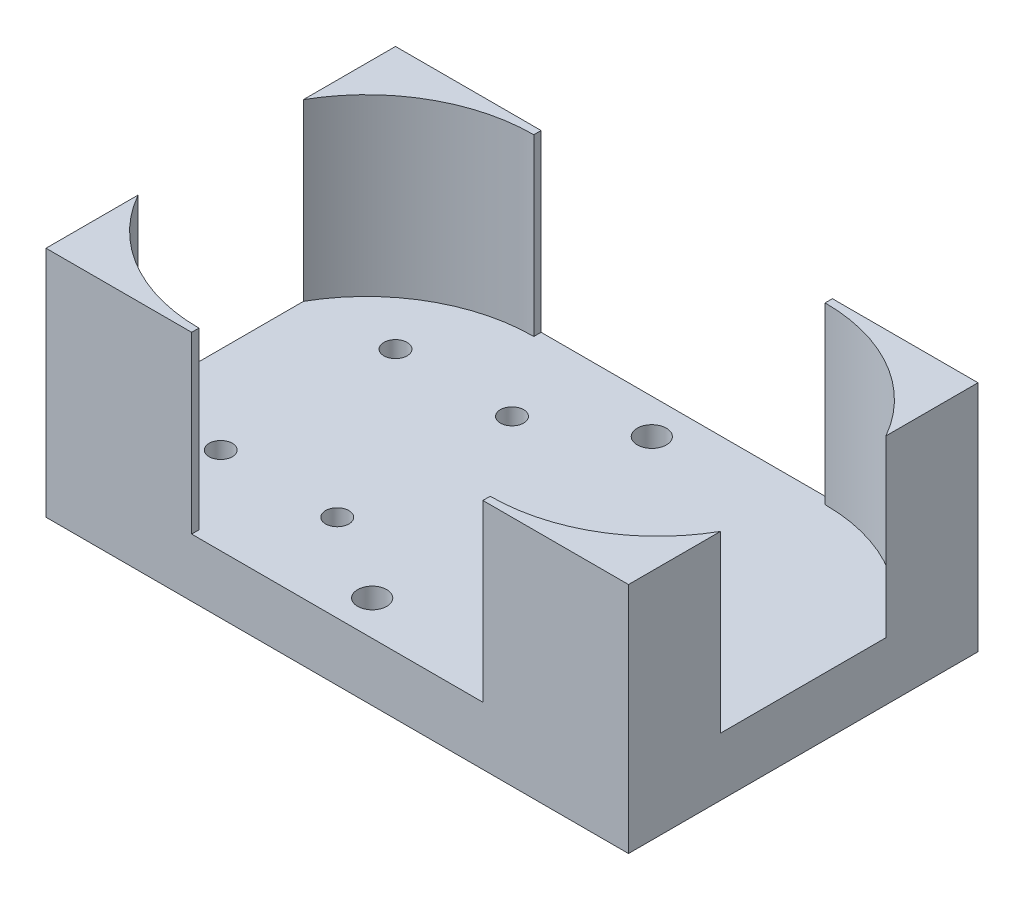
ISO-10303-21;
HEADER;
FILE_DESCRIPTION(('STEP AP214'),'2;1');
FILE_NAME('part.step','',(''),(''),'','','');
FILE_SCHEMA(('AUTOMOTIVE_DESIGN { 1 0 10303 214 1 1 1 1 }'));
ENDSEC;
DATA;
#1=APPLICATION_CONTEXT('core data for automotive mechanical design processes');
#2=APPLICATION_PROTOCOL_DEFINITION('international standard','automotive_design',2000,#1);
#3=PRODUCT_CONTEXT('',#1,'mechanical');
#4=PRODUCT('Part','Part','',(#3));
#5=PRODUCT_RELATED_PRODUCT_CATEGORY('part','',(#4));
#6=PRODUCT_DEFINITION_FORMATION('','',#4);
#7=PRODUCT_DEFINITION_CONTEXT('part definition',#1,'design');
#8=PRODUCT_DEFINITION('design','',#6,#7);
#9=PRODUCT_DEFINITION_SHAPE('','',#8);
#10=(LENGTH_UNIT() NAMED_UNIT(*) SI_UNIT(.MILLI.,.METRE.));
#11=(NAMED_UNIT(*) PLANE_ANGLE_UNIT() SI_UNIT($,.RADIAN.));
#12=(NAMED_UNIT(*) SI_UNIT($,.STERADIAN.) SOLID_ANGLE_UNIT());
#13=UNCERTAINTY_MEASURE_WITH_UNIT(LENGTH_MEASURE(1.E-05),#10,'distance_accuracy_value','');
#14=(GEOMETRIC_REPRESENTATION_CONTEXT(3) GLOBAL_UNCERTAINTY_ASSIGNED_CONTEXT((#13)) GLOBAL_UNIT_ASSIGNED_CONTEXT((#10,
#11,#12)) REPRESENTATION_CONTEXT('',''));
#15=CARTESIAN_POINT('',(0.,0.,0.));
#16=DIRECTION('',(0.,0.,1.));
#17=DIRECTION('',(1.,0.,0.));
#18=AXIS2_PLACEMENT_3D('',#15,#16,#17);
#19=CARTESIAN_POINT('',(10.,8.,-1.2));
#20=DIRECTION('',(0.,-1.,0.));
#21=DIRECTION('',(0.,0.,-1.));
#22=AXIS2_PLACEMENT_3D('',#19,#20,#21);
#23=CYLINDRICAL_SURFACE('',#22,0.500000000000001);
#24=CARTESIAN_POINT('',(10.,2.,-1.2));
#25=DIRECTION('',(0.,-1.,0.));
#26=DIRECTION('',(0.,0.,-1.));
#27=AXIS2_PLACEMENT_3D('',#24,#25,#26);
#28=CIRCLE('',#27,0.500000000000001);
#29=CARTESIAN_POINT('',(10.,2.,-1.7));
#30=VERTEX_POINT('',#29);
#31=EDGE_CURVE('E294',#30,#30,#28,.T.);
#32=ORIENTED_EDGE('',*,*,#31,.F.);
#33=EDGE_LOOP('',(#32));
#34=FACE_BOUND('',#33,.T.);
#35=CARTESIAN_POINT('',(10.,1.,-1.2));
#36=DIRECTION('',(0.,-1.,0.));
#37=DIRECTION('',(0.,0.,-1.));
#38=AXIS2_PLACEMENT_3D('',#35,#36,#37);
#39=CIRCLE('',#38,0.500000000000001);
#40=CARTESIAN_POINT('',(10.,1.,-1.7));
#41=VERTEX_POINT('',#40);
#42=EDGE_CURVE('E47',#41,#41,#39,.F.);
#43=ORIENTED_EDGE('',*,*,#42,.F.);
#44=EDGE_LOOP('',(#43));
#45=FACE_BOUND('',#44,.T.);
#46=ADVANCED_FACE('F43',(#34,#45),#23,.F.);
#47=CARTESIAN_POINT('',(10.,8.,-10.8));
#48=DIRECTION('',(0.,-1.,0.));
#49=DIRECTION('',(0.,0.,-1.));
#50=AXIS2_PLACEMENT_3D('',#47,#48,#49);
#51=CYLINDRICAL_SURFACE('',#50,0.500000000000001);
#52=CARTESIAN_POINT('',(10.,2.,-10.8));
#53=DIRECTION('',(0.,-1.,0.));
#54=DIRECTION('',(0.,0.,-1.));
#55=AXIS2_PLACEMENT_3D('',#52,#53,#54);
#56=CIRCLE('',#55,0.500000000000001);
#57=CARTESIAN_POINT('',(10.,2.,-11.3));
#58=VERTEX_POINT('',#57);
#59=EDGE_CURVE('E185',#58,#58,#56,.T.);
#60=ORIENTED_EDGE('',*,*,#59,.F.);
#61=EDGE_LOOP('',(#60));
#62=FACE_BOUND('',#61,.T.);
#63=CARTESIAN_POINT('',(10.,1.,-10.8));
#64=DIRECTION('',(0.,-1.,0.));
#65=DIRECTION('',(0.,0.,-1.));
#66=AXIS2_PLACEMENT_3D('',#63,#64,#65);
#67=CIRCLE('',#66,0.500000000000001);
#68=CARTESIAN_POINT('',(10.,1.,-11.3));
#69=VERTEX_POINT('',#68);
#70=EDGE_CURVE('E288',#69,#69,#67,.F.);
#71=ORIENTED_EDGE('',*,*,#70,.F.);
#72=EDGE_LOOP('',(#71));
#73=FACE_BOUND('',#72,.T.);
#74=ADVANCED_FACE('F318',(#62,#73),#51,.F.);
#75=CARTESIAN_POINT('',(0.,2.,0.));
#76=DIRECTION('',(1.,0.,0.));
#77=DIRECTION('',(0.,0.,-1.));
#78=AXIS2_PLACEMENT_3D('',#75,#76,#77);
#79=PLANE('',#78);
#80=DIRECTION('',(0.,0.,1.));
#81=VECTOR('',#80,1.);
#82=CARTESIAN_POINT('',(0.,0.,0.));
#83=LINE('',#82,#81);
#84=CARTESIAN_POINT('',(0.,0.,-12.));
#85=VERTEX_POINT('',#84);
#86=CARTESIAN_POINT('',(0.,0.,0.));
#87=VERTEX_POINT('',#86);
#88=EDGE_CURVE('E264',#85,#87,#83,.T.);
#89=ORIENTED_EDGE('',*,*,#88,.T.);
#90=DIRECTION('',(0.,-1.,0.));
#91=VECTOR('',#90,1.);
#92=CARTESIAN_POINT('',(0.,2.,0.));
#93=LINE('',#92,#91);
#94=CARTESIAN_POINT('',(0.,8.,0.));
#95=VERTEX_POINT('',#94);
#96=EDGE_CURVE('E12',#95,#87,#93,.T.);
#97=ORIENTED_EDGE('',*,*,#96,.F.);
#98=DIRECTION('',(0.,0.,1.));
#99=VECTOR('',#98,1.);
#100=CARTESIAN_POINT('',(0.,8.,0.));
#101=LINE('',#100,#99);
#102=CARTESIAN_POINT('',(0.,8.,-3.16054582709987));
#103=VERTEX_POINT('',#102);
#104=EDGE_CURVE('E221',#103,#95,#101,.T.);
#105=ORIENTED_EDGE('',*,*,#104,.F.);
#106=DIRECTION('',(0.,-1.,0.));
#107=VECTOR('',#106,1.);
#108=CARTESIAN_POINT('',(0.,8.,-3.16054582709987));
#109=LINE('',#108,#107);
#110=CARTESIAN_POINT('',(0.,2.,-3.16054582709987));
#111=VERTEX_POINT('',#110);
#112=EDGE_CURVE('E237',#103,#111,#109,.T.);
#113=ORIENTED_EDGE('',*,*,#112,.T.);
#114=DIRECTION('',(0.,0.,1.));
#115=VECTOR('',#114,1.);
#116=CARTESIAN_POINT('',(0.,2.,0.));
#117=LINE('',#116,#115);
#118=CARTESIAN_POINT('',(0.,2.,-8.83945417290012));
#119=VERTEX_POINT('',#118);
#120=EDGE_CURVE('E265',#119,#111,#117,.T.);
#121=ORIENTED_EDGE('',*,*,#120,.F.);
#122=DIRECTION('',(0.,-1.,0.));
#123=VECTOR('',#122,1.);
#124=CARTESIAN_POINT('',(0.,8.,-8.83945417290012));
#125=LINE('',#124,#123);
#126=CARTESIAN_POINT('',(0.,8.,-8.83945417290012));
#127=VERTEX_POINT('',#126);
#128=EDGE_CURVE('E252',#127,#119,#125,.T.);
#129=ORIENTED_EDGE('',*,*,#128,.F.);
#130=DIRECTION('',(0.,0.,1.));
#131=VECTOR('',#130,1.);
#132=CARTESIAN_POINT('',(0.,8.,0.));
#133=LINE('',#132,#131);
#134=CARTESIAN_POINT('',(0.,8.,-12.));
#135=VERTEX_POINT('',#134);
#136=EDGE_CURVE('E250',#135,#127,#133,.T.);
#137=ORIENTED_EDGE('',*,*,#136,.F.);
#138=DIRECTION('',(0.,-1.,0.));
#139=VECTOR('',#138,1.);
#140=CARTESIAN_POINT('',(0.,2.,-12.));
#141=LINE('',#140,#139);
#142=EDGE_CURVE('E274',#135,#85,#141,.T.);
#143=ORIENTED_EDGE('',*,*,#142,.T.);
#144=EDGE_LOOP('',(#89,#97,#105,#113,#121,#129,#137,#143));
#145=FACE_BOUND('',#144,.T.);
#146=ADVANCED_FACE('F45',(#145),#79,.F.);
#147=CARTESIAN_POINT('',(0.,2.,0.));
#148=DIRECTION('',(0.,0.,-1.));
#149=DIRECTION('',(-1.,0.,0.));
#150=AXIS2_PLACEMENT_3D('',#147,#148,#149);
#151=PLANE('',#150);
#152=DIRECTION('',(1.,0.,0.));
#153=VECTOR('',#152,1.);
#154=CARTESIAN_POINT('',(0.,0.,0.));
#155=LINE('',#154,#153);
#156=CARTESIAN_POINT('',(20.,0.,0.));
#157=VERTEX_POINT('',#156);
#158=EDGE_CURVE('E277',#87,#157,#155,.T.);
#159=ORIENTED_EDGE('',*,*,#158,.T.);
#160=DIRECTION('',(0.,-1.,0.));
#161=VECTOR('',#160,1.);
#162=CARTESIAN_POINT('',(20.,2.,0.));
#163=LINE('',#162,#161);
#164=CARTESIAN_POINT('',(20.,8.,0.));
#165=VERTEX_POINT('',#164);
#166=EDGE_CURVE('E52',#165,#157,#163,.T.);
#167=ORIENTED_EDGE('',*,*,#166,.F.);
#168=DIRECTION('',(1.,0.,0.));
#169=VECTOR('',#168,1.);
#170=CARTESIAN_POINT('',(0.,8.,0.));
#171=LINE('',#170,#169);
#172=CARTESIAN_POINT('',(15.,8.,0.));
#173=VERTEX_POINT('',#172);
#174=EDGE_CURVE('E176',#173,#165,#171,.T.);
#175=ORIENTED_EDGE('',*,*,#174,.F.);
#176=DIRECTION('',(0.,-1.,0.));
#177=VECTOR('',#176,1.);
#178=CARTESIAN_POINT('',(15.,8.,0.));
#179=LINE('',#178,#177);
#180=CARTESIAN_POINT('',(15.,2.,0.));
#181=VERTEX_POINT('',#180);
#182=EDGE_CURVE('E167',#173,#181,#179,.T.);
#183=ORIENTED_EDGE('',*,*,#182,.T.);
#184=DIRECTION('',(1.,0.,0.));
#185=VECTOR('',#184,1.);
#186=CARTESIAN_POINT('',(0.,2.,0.));
#187=LINE('',#186,#185);
#188=CARTESIAN_POINT('',(5.00000000000001,2.,0.));
#189=VERTEX_POINT('',#188);
#190=EDGE_CURVE('E65',#189,#181,#187,.T.);
#191=ORIENTED_EDGE('',*,*,#190,.F.);
#192=DIRECTION('',(0.,-1.,0.));
#193=VECTOR('',#192,1.);
#194=CARTESIAN_POINT('',(5.00000000000001,8.,0.));
#195=LINE('',#194,#193);
#196=CARTESIAN_POINT('',(5.00000000000001,8.,0.));
#197=VERTEX_POINT('',#196);
#198=EDGE_CURVE('E235',#197,#189,#195,.T.);
#199=ORIENTED_EDGE('',*,*,#198,.F.);
#200=DIRECTION('',(1.,0.,0.));
#201=VECTOR('',#200,1.);
#202=CARTESIAN_POINT('',(0.,8.,0.));
#203=LINE('',#202,#201);
#204=EDGE_CURVE('E225',#95,#197,#203,.T.);
#205=ORIENTED_EDGE('',*,*,#204,.F.);
#206=ORIENTED_EDGE('',*,*,#96,.T.);
#207=EDGE_LOOP('',(#159,#167,#175,#183,#191,#199,#205,#206));
#208=FACE_BOUND('',#207,.T.);
#209=ADVANCED_FACE('F326',(#208),#151,.F.);
#210=CARTESIAN_POINT('',(20.,2.,0.));
#211=DIRECTION('',(-1.,0.,0.));
#212=DIRECTION('',(0.,0.,1.));
#213=AXIS2_PLACEMENT_3D('',#210,#211,#212);
#214=PLANE('',#213);
#215=DIRECTION('',(0.,0.,-1.));
#216=VECTOR('',#215,1.);
#217=CARTESIAN_POINT('',(20.,0.,0.));
#218=LINE('',#217,#216);
#219=CARTESIAN_POINT('',(20.,0.,-12.));
#220=VERTEX_POINT('',#219);
#221=EDGE_CURVE('E279',#157,#220,#218,.T.);
#222=ORIENTED_EDGE('',*,*,#221,.T.);
#223=DIRECTION('',(0.,-1.,0.));
#224=VECTOR('',#223,1.);
#225=CARTESIAN_POINT('',(20.,2.,-12.));
#226=LINE('',#225,#224);
#227=CARTESIAN_POINT('',(20.,8.,-12.));
#228=VERTEX_POINT('',#227);
#229=EDGE_CURVE('E284',#228,#220,#226,.T.);
#230=ORIENTED_EDGE('',*,*,#229,.F.);
#231=DIRECTION('',(0.,0.,-1.));
#232=VECTOR('',#231,1.);
#233=CARTESIAN_POINT('',(20.,8.,0.));
#234=LINE('',#233,#232);
#235=CARTESIAN_POINT('',(20.,8.,-8.83945417290012));
#236=VERTEX_POINT('',#235);
#237=EDGE_CURVE('E197',#236,#228,#234,.T.);
#238=ORIENTED_EDGE('',*,*,#237,.F.);
#239=DIRECTION('',(0.,-1.,0.));
#240=VECTOR('',#239,1.);
#241=CARTESIAN_POINT('',(20.,8.,-8.83945417290012));
#242=LINE('',#241,#240);
#243=CARTESIAN_POINT('',(20.,2.,-8.83945417290012));
#244=VERTEX_POINT('',#243);
#245=EDGE_CURVE('E214',#236,#244,#242,.T.);
#246=ORIENTED_EDGE('',*,*,#245,.T.);
#247=DIRECTION('',(0.,0.,-1.));
#248=VECTOR('',#247,1.);
#249=CARTESIAN_POINT('',(20.,2.,0.));
#250=LINE('',#249,#248);
#251=CARTESIAN_POINT('',(20.,2.,-3.16054582709987));
#252=VERTEX_POINT('',#251);
#253=EDGE_CURVE('E270',#252,#244,#250,.T.);
#254=ORIENTED_EDGE('',*,*,#253,.F.);
#255=DIRECTION('',(0.,-1.,0.));
#256=VECTOR('',#255,1.);
#257=CARTESIAN_POINT('',(20.,8.,-3.16054582709987));
#258=LINE('',#257,#256);
#259=CARTESIAN_POINT('',(20.,8.,-3.16054582709987));
#260=VERTEX_POINT('',#259);
#261=EDGE_CURVE('E190',#260,#252,#258,.T.);
#262=ORIENTED_EDGE('',*,*,#261,.F.);
#263=DIRECTION('',(0.,0.,-1.));
#264=VECTOR('',#263,1.);
#265=CARTESIAN_POINT('',(20.,8.,0.));
#266=LINE('',#265,#264);
#267=EDGE_CURVE('E180',#165,#260,#266,.T.);
#268=ORIENTED_EDGE('',*,*,#267,.F.);
#269=ORIENTED_EDGE('',*,*,#166,.T.);
#270=EDGE_LOOP('',(#222,#230,#238,#246,#254,#262,#268,#269));
#271=FACE_BOUND('',#270,.T.);
#272=ADVANCED_FACE('F387',(#271),#214,.F.);
#273=CARTESIAN_POINT('',(0.,2.,-12.));
#274=DIRECTION('',(0.,0.,1.));
#275=DIRECTION('',(1.,0.,0.));
#276=AXIS2_PLACEMENT_3D('',#273,#274,#275);
#277=PLANE('',#276);
#278=DIRECTION('',(-1.,0.,0.));
#279=VECTOR('',#278,1.);
#280=CARTESIAN_POINT('',(0.,0.,-12.));
#281=LINE('',#280,#279);
#282=EDGE_CURVE('E268',#220,#85,#281,.T.);
#283=ORIENTED_EDGE('',*,*,#282,.T.);
#284=ORIENTED_EDGE('',*,*,#142,.F.);
#285=DIRECTION('',(-1.,0.,0.));
#286=VECTOR('',#285,1.);
#287=CARTESIAN_POINT('',(0.,8.,-12.));
#288=LINE('',#287,#286);
#289=CARTESIAN_POINT('',(5.00000000000001,8.,-12.));
#290=VERTEX_POINT('',#289);
#291=EDGE_CURVE('E247',#290,#135,#288,.T.);
#292=ORIENTED_EDGE('',*,*,#291,.F.);
#293=DIRECTION('',(0.,-1.,0.));
#294=VECTOR('',#293,1.);
#295=CARTESIAN_POINT('',(5.00000000000001,8.,-12.));
#296=LINE('',#295,#294);
#297=CARTESIAN_POINT('',(5.00000000000001,2.,-12.));
#298=VERTEX_POINT('',#297);
#299=EDGE_CURVE('E258',#290,#298,#296,.T.);
#300=ORIENTED_EDGE('',*,*,#299,.T.);
#301=DIRECTION('',(-1.,0.,0.));
#302=VECTOR('',#301,1.);
#303=CARTESIAN_POINT('',(0.,2.,-12.));
#304=LINE('',#303,#302);
#305=CARTESIAN_POINT('',(15.,2.,-12.));
#306=VERTEX_POINT('',#305);
#307=EDGE_CURVE('E272',#306,#298,#304,.T.);
#308=ORIENTED_EDGE('',*,*,#307,.F.);
#309=DIRECTION('',(0.,-1.,0.));
#310=VECTOR('',#309,1.);
#311=CARTESIAN_POINT('',(15.,8.,-12.));
#312=LINE('',#311,#310);
#313=CARTESIAN_POINT('',(15.,8.,-12.));
#314=VERTEX_POINT('',#313);
#315=EDGE_CURVE('E211',#314,#306,#312,.T.);
#316=ORIENTED_EDGE('',*,*,#315,.F.);
#317=DIRECTION('',(-1.,0.,0.));
#318=VECTOR('',#317,1.);
#319=CARTESIAN_POINT('',(0.,8.,-12.));
#320=LINE('',#319,#318);
#321=EDGE_CURVE('E201',#228,#314,#320,.T.);
#322=ORIENTED_EDGE('',*,*,#321,.F.);
#323=ORIENTED_EDGE('',*,*,#229,.T.);
#324=EDGE_LOOP('',(#283,#284,#292,#300,#308,#316,#322,#323));
#325=FACE_BOUND('',#324,.T.);
#326=ADVANCED_FACE('F380',(#325),#277,.F.);
#327=CARTESIAN_POINT('',(0.,2.,0.));
#328=DIRECTION('',(0.,-1.,0.));
#329=DIRECTION('',(0.,0.,-1.));
#330=AXIS2_PLACEMENT_3D('',#327,#328,#329);
#331=PLANE('',#330);
#332=CARTESIAN_POINT('',(7.,2.,-3.));
#333=DIRECTION('',(0.,-1.,0.));
#334=DIRECTION('',(0.,0.,-1.));
#335=AXIS2_PLACEMENT_3D('',#332,#333,#334);
#336=CIRCLE('',#335,0.4);
#337=CARTESIAN_POINT('',(7.,2.,-3.4));
#338=VERTEX_POINT('',#337);
#339=EDGE_CURVE('E308',#338,#338,#336,.T.);
#340=ORIENTED_EDGE('',*,*,#339,.T.);
#341=EDGE_LOOP('',(#340));
#342=FACE_BOUND('',#341,.T.);
#343=CARTESIAN_POINT('',(7.,2.,-9.));
#344=DIRECTION('',(0.,-1.,0.));
#345=DIRECTION('',(0.,0.,-1.));
#346=AXIS2_PLACEMENT_3D('',#343,#344,#345);
#347=CIRCLE('',#346,0.4);
#348=CARTESIAN_POINT('',(7.,2.,-9.4));
#349=VERTEX_POINT('',#348);
#350=EDGE_CURVE('E734',#349,#349,#347,.T.);
#351=ORIENTED_EDGE('',*,*,#350,.T.);
#352=EDGE_LOOP('',(#351));
#353=FACE_BOUND('',#352,.T.);
#354=CARTESIAN_POINT('',(3.,2.,-9.));
#355=DIRECTION('',(0.,-1.,0.));
#356=DIRECTION('',(0.,0.,-1.));
#357=AXIS2_PLACEMENT_3D('',#354,#355,#356);
#358=CIRCLE('',#357,0.4);
#359=CARTESIAN_POINT('',(3.,2.,-9.4));
#360=VERTEX_POINT('',#359);
#361=EDGE_CURVE('E736',#360,#360,#358,.T.);
#362=ORIENTED_EDGE('',*,*,#361,.T.);
#363=EDGE_LOOP('',(#362));
#364=FACE_BOUND('',#363,.T.);
#365=CARTESIAN_POINT('',(3.,2.,-3.));
#366=DIRECTION('',(0.,-1.,0.));
#367=DIRECTION('',(0.,0.,-1.));
#368=AXIS2_PLACEMENT_3D('',#365,#366,#367);
#369=CIRCLE('',#368,0.4);
#370=CARTESIAN_POINT('',(3.,2.,-3.4));
#371=VERTEX_POINT('',#370);
#372=EDGE_CURVE('E741',#371,#371,#369,.T.);
#373=ORIENTED_EDGE('',*,*,#372,.T.);
#374=EDGE_LOOP('',(#373));
#375=FACE_BOUND('',#374,.T.);
#376=ORIENTED_EDGE('',*,*,#59,.T.);
#377=EDGE_LOOP('',(#376));
#378=FACE_BOUND('',#377,.T.);
#379=ORIENTED_EDGE('',*,*,#31,.T.);
#380=EDGE_LOOP('',(#379));
#381=FACE_BOUND('',#380,.T.);
#382=DIRECTION('',(0.,0.,1.));
#383=VECTOR('',#382,1.);
#384=CARTESIAN_POINT('',(15.,2.,0.));
#385=LINE('',#384,#383);
#386=CARTESIAN_POINT('',(15.,2.,-0.249999999999997));
#387=VERTEX_POINT('',#386);
#388=EDGE_CURVE('E60',#387,#181,#385,.T.);
#389=ORIENTED_EDGE('',*,*,#388,.F.);
#390=CARTESIAN_POINT('',(15.,2.,-6.));
#391=DIRECTION('',(0.,1.,0.));
#392=DIRECTION('',(0.,0.,1.));
#393=AXIS2_PLACEMENT_3D('',#390,#391,#392);
#394=CIRCLE('',#393,5.75);
#395=EDGE_CURVE('E164',#387,#252,#394,.T.);
#396=ORIENTED_EDGE('',*,*,#395,.T.);
#397=ORIENTED_EDGE('',*,*,#253,.T.);
#398=CARTESIAN_POINT('',(15.,2.,-6.));
#399=DIRECTION('',(0.,1.,0.));
#400=DIRECTION('',(0.,0.,1.));
#401=AXIS2_PLACEMENT_3D('',#398,#399,#400);
#402=CIRCLE('',#401,5.75);
#403=CARTESIAN_POINT('',(15.,2.,-11.75));
#404=VERTEX_POINT('',#403);
#405=EDGE_CURVE('E166',#244,#404,#402,.T.);
#406=ORIENTED_EDGE('',*,*,#405,.T.);
#407=DIRECTION('',(0.,0.,1.));
#408=VECTOR('',#407,1.);
#409=CARTESIAN_POINT('',(15.,2.,0.));
#410=LINE('',#409,#408);
#411=EDGE_CURVE('E198',#306,#404,#410,.T.);
#412=ORIENTED_EDGE('',*,*,#411,.F.);
#413=ORIENTED_EDGE('',*,*,#307,.T.);
#414=DIRECTION('',(0.,0.,1.));
#415=VECTOR('',#414,1.);
#416=CARTESIAN_POINT('',(5.00000000000001,2.,0.));
#417=LINE('',#416,#415);
#418=CARTESIAN_POINT('',(5.00000000000001,2.,-11.75));
#419=VERTEX_POINT('',#418);
#420=EDGE_CURVE('E244',#298,#419,#417,.T.);
#421=ORIENTED_EDGE('',*,*,#420,.T.);
#422=CARTESIAN_POINT('',(5.00000000000001,2.,-6.));
#423=DIRECTION('',(0.,1.,0.));
#424=DIRECTION('',(0.,0.,1.));
#425=AXIS2_PLACEMENT_3D('',#422,#423,#424);
#426=CIRCLE('',#425,5.75);
#427=EDGE_CURVE('E239',#419,#119,#426,.T.);
#428=ORIENTED_EDGE('',*,*,#427,.T.);
#429=ORIENTED_EDGE('',*,*,#120,.T.);
#430=CARTESIAN_POINT('',(5.00000000000001,2.,-6.));
#431=DIRECTION('',(0.,1.,0.));
#432=DIRECTION('',(0.,0.,1.));
#433=AXIS2_PLACEMENT_3D('',#430,#431,#432);
#434=CIRCLE('',#433,5.75);
#435=CARTESIAN_POINT('',(5.00000000000001,2.,-0.249999999999995));
#436=VERTEX_POINT('',#435);
#437=EDGE_CURVE('E217',#111,#436,#434,.T.);
#438=ORIENTED_EDGE('',*,*,#437,.T.);
#439=DIRECTION('',(0.,0.,1.));
#440=VECTOR('',#439,1.);
#441=CARTESIAN_POINT('',(5.00000000000001,2.,0.));
#442=LINE('',#441,#440);
#443=EDGE_CURVE('E222',#436,#189,#442,.T.);
#444=ORIENTED_EDGE('',*,*,#443,.T.);
#445=ORIENTED_EDGE('',*,*,#190,.T.);
#446=EDGE_LOOP('',(#389,#396,#397,#406,#412,#413,#421,#428,#429,#438,#444,#445));
#447=FACE_BOUND('',#446,.T.);
#448=ADVANCED_FACE('F316',(#342,#353,#364,#375,#378,#381,#447),#331,.F.);
#449=CARTESIAN_POINT('',(0.,0.,0.));
#450=DIRECTION('',(0.,-1.,0.));
#451=DIRECTION('',(0.,0.,-1.));
#452=AXIS2_PLACEMENT_3D('',#449,#450,#451);
#453=PLANE('',#452);
#454=CARTESIAN_POINT('',(7.,0.,-3.));
#455=DIRECTION('',(0.,-1.,0.));
#456=DIRECTION('',(0.,0.,-1.));
#457=AXIS2_PLACEMENT_3D('',#454,#455,#456);
#458=CIRCLE('',#457,0.4);
#459=CARTESIAN_POINT('',(7.,0.,-3.4));
#460=VERTEX_POINT('',#459);
#461=EDGE_CURVE('E731',#460,#460,#458,.T.);
#462=ORIENTED_EDGE('',*,*,#461,.F.);
#463=EDGE_LOOP('',(#462));
#464=FACE_BOUND('',#463,.T.);
#465=CARTESIAN_POINT('',(7.,0.,-9.));
#466=DIRECTION('',(0.,-1.,0.));
#467=DIRECTION('',(0.,0.,-1.));
#468=AXIS2_PLACEMENT_3D('',#465,#466,#467);
#469=CIRCLE('',#468,0.4);
#470=CARTESIAN_POINT('',(7.,0.,-9.4));
#471=VERTEX_POINT('',#470);
#472=EDGE_CURVE('E749',#471,#471,#469,.T.);
#473=ORIENTED_EDGE('',*,*,#472,.F.);
#474=EDGE_LOOP('',(#473));
#475=FACE_BOUND('',#474,.T.);
#476=CARTESIAN_POINT('',(3.,0.,-9.));
#477=DIRECTION('',(0.,-1.,0.));
#478=DIRECTION('',(0.,0.,-1.));
#479=AXIS2_PLACEMENT_3D('',#476,#477,#478);
#480=CIRCLE('',#479,0.4);
#481=CARTESIAN_POINT('',(3.,0.,-9.4));
#482=VERTEX_POINT('',#481);
#483=EDGE_CURVE('E747',#482,#482,#480,.T.);
#484=ORIENTED_EDGE('',*,*,#483,.F.);
#485=EDGE_LOOP('',(#484));
#486=FACE_BOUND('',#485,.T.);
#487=CARTESIAN_POINT('',(3.,0.,-3.));
#488=DIRECTION('',(0.,-1.,0.));
#489=DIRECTION('',(0.,0.,-1.));
#490=AXIS2_PLACEMENT_3D('',#487,#488,#489);
#491=CIRCLE('',#490,0.4);
#492=CARTESIAN_POINT('',(3.,0.,-3.4));
#493=VERTEX_POINT('',#492);
#494=EDGE_CURVE('E744',#493,#493,#491,.T.);
#495=ORIENTED_EDGE('',*,*,#494,.F.);
#496=EDGE_LOOP('',(#495));
#497=FACE_BOUND('',#496,.T.);
#498=CARTESIAN_POINT('',(10.,0.,-10.8));
#499=DIRECTION('',(0.,-1.,0.));
#500=DIRECTION('',(0.,0.,-1.));
#501=AXIS2_PLACEMENT_3D('',#498,#499,#500);
#502=CIRCLE('',#501,0.999999999999999);
#503=CARTESIAN_POINT('',(10.,0.,-11.8));
#504=VERTEX_POINT('',#503);
#505=EDGE_CURVE('E296',#504,#504,#502,.T.);
#506=ORIENTED_EDGE('',*,*,#505,.F.);
#507=EDGE_LOOP('',(#506));
#508=FACE_BOUND('',#507,.T.);
#509=CARTESIAN_POINT('',(10.,0.,-1.2));
#510=DIRECTION('',(0.,-1.,0.));
#511=DIRECTION('',(0.,0.,-1.));
#512=AXIS2_PLACEMENT_3D('',#509,#510,#511);
#513=CIRCLE('',#512,1.);
#514=CARTESIAN_POINT('',(10.,0.,-2.2));
#515=VERTEX_POINT('',#514);
#516=EDGE_CURVE('E301',#515,#515,#513,.T.);
#517=ORIENTED_EDGE('',*,*,#516,.F.);
#518=EDGE_LOOP('',(#517));
#519=FACE_BOUND('',#518,.T.);
#520=ORIENTED_EDGE('',*,*,#88,.F.);
#521=ORIENTED_EDGE('',*,*,#282,.F.);
#522=ORIENTED_EDGE('',*,*,#221,.F.);
#523=ORIENTED_EDGE('',*,*,#158,.F.);
#524=EDGE_LOOP('',(#520,#521,#522,#523));
#525=FACE_BOUND('',#524,.T.);
#526=ADVANCED_FACE('F376',(#464,#475,#486,#497,#508,#519,#525),#453,.T.);
#527=CARTESIAN_POINT('',(5.00000000000001,8.,-6.));
#528=DIRECTION('',(0.,-1.,0.));
#529=DIRECTION('',(0.,0.,-1.));
#530=AXIS2_PLACEMENT_3D('',#527,#528,#529);
#531=CYLINDRICAL_SURFACE('',#530,5.75);
#532=ORIENTED_EDGE('',*,*,#427,.F.);
#533=DIRECTION('',(0.,-1.,0.));
#534=VECTOR('',#533,1.);
#535=CARTESIAN_POINT('',(5.00000000000001,8.,-11.75));
#536=LINE('',#535,#534);
#537=CARTESIAN_POINT('',(5.00000000000001,8.,-11.75));
#538=VERTEX_POINT('',#537);
#539=EDGE_CURVE('E261',#538,#419,#536,.T.);
#540=ORIENTED_EDGE('',*,*,#539,.F.);
#541=CARTESIAN_POINT('',(5.00000000000001,8.,-6.));
#542=DIRECTION('',(0.,1.,0.));
#543=DIRECTION('',(0.,0.,1.));
#544=AXIS2_PLACEMENT_3D('',#541,#542,#543);
#545=CIRCLE('',#544,5.75);
#546=EDGE_CURVE('E240',#538,#127,#545,.T.);
#547=ORIENTED_EDGE('',*,*,#546,.T.);
#548=ORIENTED_EDGE('',*,*,#128,.T.);
#549=EDGE_LOOP('',(#532,#540,#547,#548));
#550=FACE_BOUND('',#549,.T.);
#551=ADVANCED_FACE('F372',(#550),#531,.F.);
#552=CARTESIAN_POINT('',(5.00000000000001,8.,0.));
#553=DIRECTION('',(1.,0.,0.));
#554=DIRECTION('',(0.,0.,-1.));
#555=AXIS2_PLACEMENT_3D('',#552,#553,#554);
#556=PLANE('',#555);
#557=ORIENTED_EDGE('',*,*,#420,.F.);
#558=ORIENTED_EDGE('',*,*,#299,.F.);
#559=DIRECTION('',(0.,0.,1.));
#560=VECTOR('',#559,1.);
#561=CARTESIAN_POINT('',(5.00000000000001,8.,0.));
#562=LINE('',#561,#560);
#563=EDGE_CURVE('E243',#290,#538,#562,.T.);
#564=ORIENTED_EDGE('',*,*,#563,.T.);
#565=ORIENTED_EDGE('',*,*,#539,.T.);
#566=EDGE_LOOP('',(#557,#558,#564,#565));
#567=FACE_BOUND('',#566,.T.);
#568=ADVANCED_FACE('F368',(#567),#556,.T.);
#569=CARTESIAN_POINT('',(0.,8.,0.));
#570=DIRECTION('',(0.,1.,0.));
#571=DIRECTION('',(0.,0.,1.));
#572=AXIS2_PLACEMENT_3D('',#569,#570,#571);
#573=PLANE('',#572);
#574=ORIENTED_EDGE('',*,*,#546,.F.);
#575=ORIENTED_EDGE('',*,*,#563,.F.);
#576=ORIENTED_EDGE('',*,*,#291,.T.);
#577=ORIENTED_EDGE('',*,*,#136,.T.);
#578=EDGE_LOOP('',(#574,#575,#576,#577));
#579=FACE_BOUND('',#578,.T.);
#580=ADVANCED_FACE('F364',(#579),#573,.T.);
#581=CARTESIAN_POINT('',(5.00000000000001,8.,-6.));
#582=DIRECTION('',(0.,-1.,0.));
#583=DIRECTION('',(0.,0.,-1.));
#584=AXIS2_PLACEMENT_3D('',#581,#582,#583);
#585=CYLINDRICAL_SURFACE('',#584,5.75);
#586=ORIENTED_EDGE('',*,*,#437,.F.);
#587=ORIENTED_EDGE('',*,*,#112,.F.);
#588=CARTESIAN_POINT('',(5.00000000000001,8.,-6.));
#589=DIRECTION('',(0.,1.,0.));
#590=DIRECTION('',(0.,0.,1.));
#591=AXIS2_PLACEMENT_3D('',#588,#589,#590);
#592=CIRCLE('',#591,5.75);
#593=CARTESIAN_POINT('',(5.00000000000001,8.,-0.249999999999995));
#594=VERTEX_POINT('',#593);
#595=EDGE_CURVE('E218',#103,#594,#592,.T.);
#596=ORIENTED_EDGE('',*,*,#595,.T.);
#597=DIRECTION('',(0.,-1.,0.));
#598=VECTOR('',#597,1.);
#599=CARTESIAN_POINT('',(5.00000000000001,8.,-0.249999999999995));
#600=LINE('',#599,#598);
#601=EDGE_CURVE('E230',#594,#436,#600,.T.);
#602=ORIENTED_EDGE('',*,*,#601,.T.);
#603=EDGE_LOOP('',(#586,#587,#596,#602));
#604=FACE_BOUND('',#603,.T.);
#605=ADVANCED_FACE('F360',(#604),#585,.F.);
#606=CARTESIAN_POINT('',(5.00000000000001,8.,0.));
#607=DIRECTION('',(1.,0.,0.));
#608=DIRECTION('',(0.,0.,-1.));
#609=AXIS2_PLACEMENT_3D('',#606,#607,#608);
#610=PLANE('',#609);
#611=ORIENTED_EDGE('',*,*,#443,.F.);
#612=ORIENTED_EDGE('',*,*,#601,.F.);
#613=DIRECTION('',(0.,0.,1.));
#614=VECTOR('',#613,1.);
#615=CARTESIAN_POINT('',(5.00000000000001,8.,0.));
#616=LINE('',#615,#614);
#617=EDGE_CURVE('E227',#594,#197,#616,.T.);
#618=ORIENTED_EDGE('',*,*,#617,.T.);
#619=ORIENTED_EDGE('',*,*,#198,.T.);
#620=EDGE_LOOP('',(#611,#612,#618,#619));
#621=FACE_BOUND('',#620,.T.);
#622=ADVANCED_FACE('F356',(#621),#610,.T.);
#623=CARTESIAN_POINT('',(0.,8.,0.));
#624=DIRECTION('',(0.,1.,0.));
#625=DIRECTION('',(0.,0.,1.));
#626=AXIS2_PLACEMENT_3D('',#623,#624,#625);
#627=PLANE('',#626);
#628=ORIENTED_EDGE('',*,*,#595,.F.);
#629=ORIENTED_EDGE('',*,*,#104,.T.);
#630=ORIENTED_EDGE('',*,*,#204,.T.);
#631=ORIENTED_EDGE('',*,*,#617,.F.);
#632=EDGE_LOOP('',(#628,#629,#630,#631));
#633=FACE_BOUND('',#632,.T.);
#634=ADVANCED_FACE('F352',(#633),#627,.T.);
#635=CARTESIAN_POINT('',(15.,8.,-6.));
#636=DIRECTION('',(0.,-1.,0.));
#637=DIRECTION('',(0.,0.,-1.));
#638=AXIS2_PLACEMENT_3D('',#635,#636,#637);
#639=CYLINDRICAL_SURFACE('',#638,5.75);
#640=ORIENTED_EDGE('',*,*,#405,.F.);
#641=ORIENTED_EDGE('',*,*,#245,.F.);
#642=CARTESIAN_POINT('',(15.,8.,-6.));
#643=DIRECTION('',(0.,1.,0.));
#644=DIRECTION('',(0.,0.,1.));
#645=AXIS2_PLACEMENT_3D('',#642,#643,#644);
#646=CIRCLE('',#645,5.75);
#647=CARTESIAN_POINT('',(15.,8.,-11.75));
#648=VERTEX_POINT('',#647);
#649=EDGE_CURVE('E194',#236,#648,#646,.T.);
#650=ORIENTED_EDGE('',*,*,#649,.T.);
#651=DIRECTION('',(0.,-1.,0.));
#652=VECTOR('',#651,1.);
#653=CARTESIAN_POINT('',(15.,8.,-11.75));
#654=LINE('',#653,#652);
#655=EDGE_CURVE('E205',#648,#404,#654,.T.);
#656=ORIENTED_EDGE('',*,*,#655,.T.);
#657=EDGE_LOOP('',(#640,#641,#650,#656));
#658=FACE_BOUND('',#657,.T.);
#659=ADVANCED_FACE('F348',(#658),#639,.F.);
#660=CARTESIAN_POINT('',(15.,8.,0.));
#661=DIRECTION('',(1.,0.,0.));
#662=DIRECTION('',(0.,0.,-1.));
#663=AXIS2_PLACEMENT_3D('',#660,#661,#662);
#664=PLANE('',#663);
#665=ORIENTED_EDGE('',*,*,#411,.T.);
#666=ORIENTED_EDGE('',*,*,#655,.F.);
#667=DIRECTION('',(0.,0.,1.));
#668=VECTOR('',#667,1.);
#669=CARTESIAN_POINT('',(15.,8.,0.));
#670=LINE('',#669,#668);
#671=EDGE_CURVE('E203',#314,#648,#670,.T.);
#672=ORIENTED_EDGE('',*,*,#671,.F.);
#673=ORIENTED_EDGE('',*,*,#315,.T.);
#674=EDGE_LOOP('',(#665,#666,#672,#673));
#675=FACE_BOUND('',#674,.T.);
#676=ADVANCED_FACE('F344',(#675),#664,.F.);
#677=CARTESIAN_POINT('',(0.,8.,0.));
#678=DIRECTION('',(0.,1.,0.));
#679=DIRECTION('',(0.,0.,1.));
#680=AXIS2_PLACEMENT_3D('',#677,#678,#679);
#681=PLANE('',#680);
#682=ORIENTED_EDGE('',*,*,#649,.F.);
#683=ORIENTED_EDGE('',*,*,#237,.T.);
#684=ORIENTED_EDGE('',*,*,#321,.T.);
#685=ORIENTED_EDGE('',*,*,#671,.T.);
#686=EDGE_LOOP('',(#682,#683,#684,#685));
#687=FACE_BOUND('',#686,.T.);
#688=ADVANCED_FACE('F341',(#687),#681,.T.);
#689=CARTESIAN_POINT('',(15.,8.,-6.));
#690=DIRECTION('',(0.,-1.,0.));
#691=DIRECTION('',(0.,0.,-1.));
#692=AXIS2_PLACEMENT_3D('',#689,#690,#691);
#693=CYLINDRICAL_SURFACE('',#692,5.75);
#694=ORIENTED_EDGE('',*,*,#395,.F.);
#695=DIRECTION('',(0.,-1.,0.));
#696=VECTOR('',#695,1.);
#697=CARTESIAN_POINT('',(15.,8.,-0.249999999999997));
#698=LINE('',#697,#696);
#699=CARTESIAN_POINT('',(15.,8.,-0.249999999999997));
#700=VERTEX_POINT('',#699);
#701=EDGE_CURVE('E158',#700,#387,#698,.T.);
#702=ORIENTED_EDGE('',*,*,#701,.F.);
#703=CARTESIAN_POINT('',(15.,8.,-6.));
#704=DIRECTION('',(0.,1.,0.));
#705=DIRECTION('',(0.,0.,1.));
#706=AXIS2_PLACEMENT_3D('',#703,#704,#705);
#707=CIRCLE('',#706,5.75);
#708=EDGE_CURVE('E163',#700,#260,#707,.T.);
#709=ORIENTED_EDGE('',*,*,#708,.T.);
#710=ORIENTED_EDGE('',*,*,#261,.T.);
#711=EDGE_LOOP('',(#694,#702,#709,#710));
#712=FACE_BOUND('',#711,.T.);
#713=ADVANCED_FACE('F160',(#712),#693,.F.);
#714=CARTESIAN_POINT('',(15.,8.,0.));
#715=DIRECTION('',(1.,0.,0.));
#716=DIRECTION('',(0.,0.,-1.));
#717=AXIS2_PLACEMENT_3D('',#714,#715,#716);
#718=PLANE('',#717);
#719=ORIENTED_EDGE('',*,*,#388,.T.);
#720=ORIENTED_EDGE('',*,*,#182,.F.);
#721=DIRECTION('',(0.,0.,1.));
#722=VECTOR('',#721,1.);
#723=CARTESIAN_POINT('',(15.,8.,0.));
#724=LINE('',#723,#722);
#725=EDGE_CURVE('E170',#700,#173,#724,.T.);
#726=ORIENTED_EDGE('',*,*,#725,.F.);
#727=ORIENTED_EDGE('',*,*,#701,.T.);
#728=EDGE_LOOP('',(#719,#720,#726,#727));
#729=FACE_BOUND('',#728,.T.);
#730=ADVANCED_FACE('F171',(#729),#718,.F.);
#731=CARTESIAN_POINT('',(0.,8.,0.));
#732=DIRECTION('',(0.,1.,0.));
#733=DIRECTION('',(0.,0.,1.));
#734=AXIS2_PLACEMENT_3D('',#731,#732,#733);
#735=PLANE('',#734);
#736=ORIENTED_EDGE('',*,*,#708,.F.);
#737=ORIENTED_EDGE('',*,*,#725,.T.);
#738=ORIENTED_EDGE('',*,*,#174,.T.);
#739=ORIENTED_EDGE('',*,*,#267,.T.);
#740=EDGE_LOOP('',(#736,#737,#738,#739));
#741=FACE_BOUND('',#740,.T.);
#742=ADVANCED_FACE('F178',(#741),#735,.T.);
#743=CARTESIAN_POINT('',(0.,1.,0.));
#744=DIRECTION('',(0.,-1.,0.));
#745=DIRECTION('',(0.,0.,-1.));
#746=AXIS2_PLACEMENT_3D('',#743,#744,#745);
#747=PLANE('',#746);
#748=CARTESIAN_POINT('',(10.,1.,-10.8));
#749=DIRECTION('',(0.,-1.,0.));
#750=DIRECTION('',(0.,0.,-1.));
#751=AXIS2_PLACEMENT_3D('',#748,#749,#750);
#752=CIRCLE('',#751,0.999999999999999);
#753=CARTESIAN_POINT('',(10.,1.,-11.8));
#754=VERTEX_POINT('',#753);
#755=EDGE_CURVE('E290',#754,#754,#752,.F.);
#756=ORIENTED_EDGE('',*,*,#755,.F.);
#757=EDGE_LOOP('',(#756));
#758=FACE_BOUND('',#757,.T.);
#759=ORIENTED_EDGE('',*,*,#70,.T.);
#760=EDGE_LOOP('',(#759));
#761=FACE_BOUND('',#760,.T.);
#762=ADVANCED_FACE('F336',(#758,#761),#747,.T.);
#763=CARTESIAN_POINT('',(10.,4.82842712474619,-10.8));
#764=DIRECTION('',(0.,-1.,0.));
#765=DIRECTION('',(0.,0.,-1.));
#766=AXIS2_PLACEMENT_3D('',#763,#764,#765);
#767=CYLINDRICAL_SURFACE('',#766,0.999999999999999);
#768=ORIENTED_EDGE('',*,*,#755,.T.);
#769=EDGE_LOOP('',(#768));
#770=FACE_BOUND('',#769,.T.);
#771=ORIENTED_EDGE('',*,*,#505,.T.);
#772=EDGE_LOOP('',(#771));
#773=FACE_BOUND('',#772,.T.);
#774=ADVANCED_FACE('F496',(#770,#773),#767,.F.);
#775=CARTESIAN_POINT('',(0.,1.,0.));
#776=DIRECTION('',(0.,-1.,0.));
#777=DIRECTION('',(0.,0.,-1.));
#778=AXIS2_PLACEMENT_3D('',#775,#776,#777);
#779=PLANE('',#778);
#780=CARTESIAN_POINT('',(10.,1.,-1.2));
#781=DIRECTION('',(0.,-1.,0.));
#782=DIRECTION('',(0.,0.,-1.));
#783=AXIS2_PLACEMENT_3D('',#780,#781,#782);
#784=CIRCLE('',#783,1.);
#785=CARTESIAN_POINT('',(10.,1.,-2.2));
#786=VERTEX_POINT('',#785);
#787=EDGE_CURVE('E305',#786,#786,#784,.F.);
#788=ORIENTED_EDGE('',*,*,#787,.F.);
#789=EDGE_LOOP('',(#788));
#790=FACE_BOUND('',#789,.T.);
#791=ORIENTED_EDGE('',*,*,#42,.T.);
#792=EDGE_LOOP('',(#791));
#793=FACE_BOUND('',#792,.T.);
#794=ADVANCED_FACE('F331',(#790,#793),#779,.T.);
#795=CARTESIAN_POINT('',(10.,4.82842712474619,-1.2));
#796=DIRECTION('',(0.,-1.,0.));
#797=DIRECTION('',(0.,0.,-1.));
#798=AXIS2_PLACEMENT_3D('',#795,#796,#797);
#799=CYLINDRICAL_SURFACE('',#798,1.);
#800=ORIENTED_EDGE('',*,*,#787,.T.);
#801=EDGE_LOOP('',(#800));
#802=FACE_BOUND('',#801,.T.);
#803=ORIENTED_EDGE('',*,*,#516,.T.);
#804=EDGE_LOOP('',(#803));
#805=FACE_BOUND('',#804,.T.);
#806=ADVANCED_FACE('F510',(#802,#805),#799,.F.);
#807=CARTESIAN_POINT('',(3.,8.,-3.));
#808=DIRECTION('',(0.,-1.,0.));
#809=DIRECTION('',(0.,0.,-1.));
#810=AXIS2_PLACEMENT_3D('',#807,#808,#809);
#811=CYLINDRICAL_SURFACE('',#810,0.4);
#812=ORIENTED_EDGE('',*,*,#494,.T.);
#813=EDGE_LOOP('',(#812));
#814=FACE_BOUND('',#813,.T.);
#815=ORIENTED_EDGE('',*,*,#372,.F.);
#816=EDGE_LOOP('',(#815));
#817=FACE_BOUND('',#816,.T.);
#818=ADVANCED_FACE('F516',(#814,#817),#811,.F.);
#819=CARTESIAN_POINT('',(3.,8.,-9.));
#820=DIRECTION('',(0.,-1.,0.));
#821=DIRECTION('',(0.,0.,-1.));
#822=AXIS2_PLACEMENT_3D('',#819,#820,#821);
#823=CYLINDRICAL_SURFACE('',#822,0.4);
#824=ORIENTED_EDGE('',*,*,#483,.T.);
#825=EDGE_LOOP('',(#824));
#826=FACE_BOUND('',#825,.T.);
#827=ORIENTED_EDGE('',*,*,#361,.F.);
#828=EDGE_LOOP('',(#827));
#829=FACE_BOUND('',#828,.T.);
#830=ADVANCED_FACE('F522',(#826,#829),#823,.F.);
#831=CARTESIAN_POINT('',(7.,8.,-9.));
#832=DIRECTION('',(0.,-1.,0.));
#833=DIRECTION('',(0.,0.,-1.));
#834=AXIS2_PLACEMENT_3D('',#831,#832,#833);
#835=CYLINDRICAL_SURFACE('',#834,0.4);
#836=ORIENTED_EDGE('',*,*,#472,.T.);
#837=EDGE_LOOP('',(#836));
#838=FACE_BOUND('',#837,.T.);
#839=ORIENTED_EDGE('',*,*,#350,.F.);
#840=EDGE_LOOP('',(#839));
#841=FACE_BOUND('',#840,.T.);
#842=ADVANCED_FACE('F530',(#838,#841),#835,.F.);
#843=CARTESIAN_POINT('',(7.,8.,-3.));
#844=DIRECTION('',(0.,-1.,0.));
#845=DIRECTION('',(0.,0.,-1.));
#846=AXIS2_PLACEMENT_3D('',#843,#844,#845);
#847=CYLINDRICAL_SURFACE('',#846,0.4);
#848=ORIENTED_EDGE('',*,*,#461,.T.);
#849=EDGE_LOOP('',(#848));
#850=FACE_BOUND('',#849,.T.);
#851=ORIENTED_EDGE('',*,*,#339,.F.);
#852=EDGE_LOOP('',(#851));
#853=FACE_BOUND('',#852,.T.);
#854=ADVANCED_FACE('F538',(#850,#853),#847,.F.);
#855=CLOSED_SHELL('',(#46,#74,#146,#209,#272,#326,#448,#526,#551,#568,#580,#605,#622,#634,#659,
#676,#688,#713,#730,#742,#762,#774,#794,#806,#818,#830,#842,#854));
#856=MANIFOLD_SOLID_BREP('B2',#855);
#857=ADVANCED_BREP_SHAPE_REPRESENTATION('',(#18,#856),#14);
#858=SHAPE_DEFINITION_REPRESENTATION(#9,#857);
ENDSEC;
END-ISO-10303-21;
